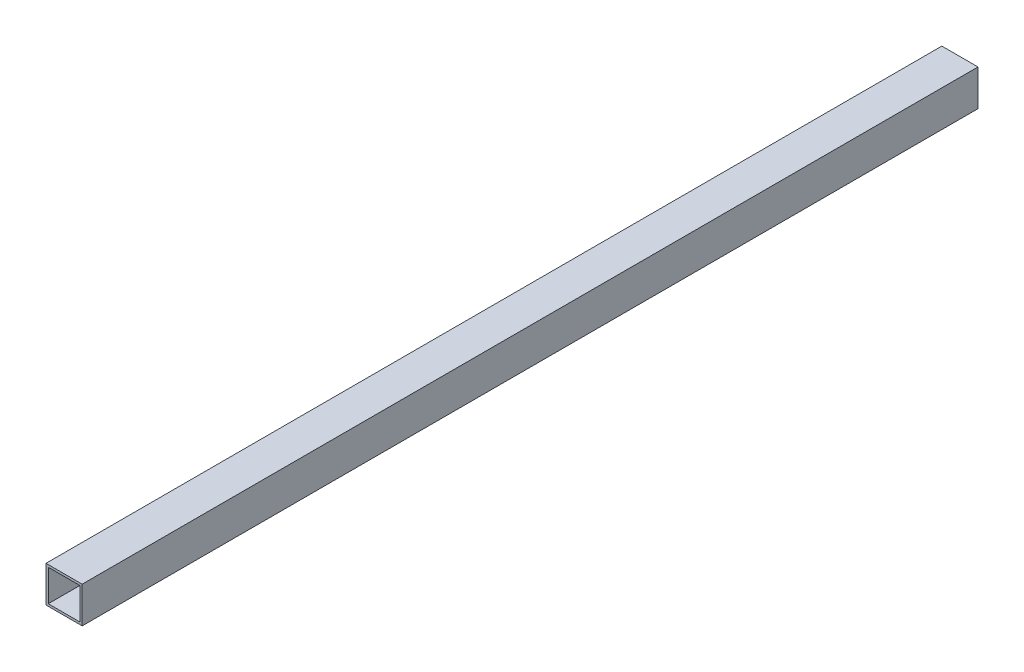
ISO-10303-21;
HEADER;
FILE_DESCRIPTION(('STEP AP214'),'2;1');
FILE_NAME('part.step','',(''),(''),'','','');
FILE_SCHEMA(('AUTOMOTIVE_DESIGN { 1 0 10303 214 1 1 1 1 }'));
ENDSEC;
DATA;
#1=APPLICATION_CONTEXT('core data for automotive mechanical design processes');
#2=APPLICATION_PROTOCOL_DEFINITION('international standard','automotive_design',2000,#1);
#3=PRODUCT_CONTEXT('',#1,'mechanical');
#4=PRODUCT('Part','Part','',(#3));
#5=PRODUCT_RELATED_PRODUCT_CATEGORY('part','',(#4));
#6=PRODUCT_DEFINITION_FORMATION('','',#4);
#7=PRODUCT_DEFINITION_CONTEXT('part definition',#1,'design');
#8=PRODUCT_DEFINITION('design','',#6,#7);
#9=PRODUCT_DEFINITION_SHAPE('','',#8);
#10=(LENGTH_UNIT() NAMED_UNIT(*) SI_UNIT(.MILLI.,.METRE.));
#11=(NAMED_UNIT(*) PLANE_ANGLE_UNIT() SI_UNIT($,.RADIAN.));
#12=(NAMED_UNIT(*) SI_UNIT($,.STERADIAN.) SOLID_ANGLE_UNIT());
#13=UNCERTAINTY_MEASURE_WITH_UNIT(LENGTH_MEASURE(1.E-05),#10,'distance_accuracy_value','');
#14=(GEOMETRIC_REPRESENTATION_CONTEXT(3) GLOBAL_UNCERTAINTY_ASSIGNED_CONTEXT((#13)) GLOBAL_UNIT_ASSIGNED_CONTEXT((#10,
#11,#12)) REPRESENTATION_CONTEXT('',''));
#15=CARTESIAN_POINT('',(0.,0.,0.));
#16=DIRECTION('',(0.,0.,1.));
#17=DIRECTION('',(1.,0.,0.));
#18=AXIS2_PLACEMENT_3D('',#15,#16,#17);
#19=CARTESIAN_POINT('',(0.,0.,314.6396933));
#20=DIRECTION('',(0.,0.,-1.));
#21=DIRECTION('',(-1.,0.,0.));
#22=AXIS2_PLACEMENT_3D('',#19,#20,#21);
#23=PLANE('',#22);
#24=DIRECTION('',(0.,-1.,0.));
#25=VECTOR('',#24,1.);
#26=CARTESIAN_POINT('',(-12.7,12.7,314.6396933));
#27=LINE('',#26,#25);
#28=CARTESIAN_POINT('',(-12.7,12.7,314.6396933));
#29=VERTEX_POINT('',#28);
#30=CARTESIAN_POINT('',(-12.7,-12.7,314.6396933));
#31=VERTEX_POINT('',#30);
#32=EDGE_CURVE('E134',#29,#31,#27,.T.);
#33=ORIENTED_EDGE('',*,*,#32,.T.);
#34=DIRECTION('',(1.,0.,0.));
#35=VECTOR('',#34,1.);
#36=CARTESIAN_POINT('',(12.7,-12.7,314.6396933));
#37=LINE('',#36,#35);
#38=CARTESIAN_POINT('',(12.7,-12.7,314.6396933));
#39=VERTEX_POINT('',#38);
#40=EDGE_CURVE('E137',#31,#39,#37,.T.);
#41=ORIENTED_EDGE('',*,*,#40,.T.);
#42=DIRECTION('',(0.,1.,0.));
#43=VECTOR('',#42,1.);
#44=CARTESIAN_POINT('',(12.7,12.7,314.6396933));
#45=LINE('',#44,#43);
#46=CARTESIAN_POINT('',(12.7,12.7,314.6396933));
#47=VERTEX_POINT('',#46);
#48=EDGE_CURVE('E140',#39,#47,#45,.T.);
#49=ORIENTED_EDGE('',*,*,#48,.T.);
#50=DIRECTION('',(-1.,0.,0.));
#51=VECTOR('',#50,1.);
#52=CARTESIAN_POINT('',(12.7,12.7,314.6396933));
#53=LINE('',#52,#51);
#54=EDGE_CURVE('E142',#47,#29,#53,.T.);
#55=ORIENTED_EDGE('',*,*,#54,.T.);
#56=EDGE_LOOP('',(#33,#41,#49,#55));
#57=FACE_BOUND('',#56,.T.);
#58=DIRECTION('',(0.,-1.,0.));
#59=VECTOR('',#58,1.);
#60=CARTESIAN_POINT('',(-11.1125,11.1125,314.6396933));
#61=LINE('',#60,#59);
#62=CARTESIAN_POINT('',(-11.1125,11.1125,314.6396933));
#63=VERTEX_POINT('',#62);
#64=CARTESIAN_POINT('',(-11.1125,-11.1125,314.6396933));
#65=VERTEX_POINT('',#64);
#66=EDGE_CURVE('E98',#63,#65,#61,.T.);
#67=ORIENTED_EDGE('',*,*,#66,.F.);
#68=DIRECTION('',(-1.,0.,0.));
#69=VECTOR('',#68,1.);
#70=CARTESIAN_POINT('',(11.1125,11.1125,314.6396933));
#71=LINE('',#70,#69);
#72=CARTESIAN_POINT('',(11.1125,11.1125,314.6396933));
#73=VERTEX_POINT('',#72);
#74=EDGE_CURVE('E120',#73,#63,#71,.T.);
#75=ORIENTED_EDGE('',*,*,#74,.F.);
#76=DIRECTION('',(0.,1.,0.));
#77=VECTOR('',#76,1.);
#78=CARTESIAN_POINT('',(11.1125,11.1125,314.6396933));
#79=LINE('',#78,#77);
#80=CARTESIAN_POINT('',(11.1125,-11.1125,314.6396933));
#81=VERTEX_POINT('',#80);
#82=EDGE_CURVE('E118',#81,#73,#79,.T.);
#83=ORIENTED_EDGE('',*,*,#82,.F.);
#84=DIRECTION('',(1.,0.,0.));
#85=VECTOR('',#84,1.);
#86=CARTESIAN_POINT('',(11.1125,-11.1125,314.6396933));
#87=LINE('',#86,#85);
#88=EDGE_CURVE('E106',#65,#81,#87,.T.);
#89=ORIENTED_EDGE('',*,*,#88,.F.);
#90=EDGE_LOOP('',(#67,#75,#83,#89));
#91=FACE_BOUND('',#90,.T.);
#92=ADVANCED_FACE('F33',(#57,#91),#23,.F.);
#93=CARTESIAN_POINT('',(0.,0.,-314.6396933));
#94=DIRECTION('',(0.,0.,-1.));
#95=DIRECTION('',(-1.,0.,0.));
#96=AXIS2_PLACEMENT_3D('',#93,#94,#95);
#97=PLANE('',#96);
#98=DIRECTION('',(0.,-1.,0.));
#99=VECTOR('',#98,1.);
#100=CARTESIAN_POINT('',(-12.7,12.7,-314.6396933));
#101=LINE('',#100,#99);
#102=CARTESIAN_POINT('',(-12.7,12.7,-314.6396933));
#103=VERTEX_POINT('',#102);
#104=CARTESIAN_POINT('',(-12.7,-12.7,-314.6396933));
#105=VERTEX_POINT('',#104);
#106=EDGE_CURVE('E114',#103,#105,#101,.T.);
#107=ORIENTED_EDGE('',*,*,#106,.F.);
#108=DIRECTION('',(-1.,0.,0.));
#109=VECTOR('',#108,1.);
#110=CARTESIAN_POINT('',(12.7,12.7,-314.6396933));
#111=LINE('',#110,#109);
#112=CARTESIAN_POINT('',(12.7,12.7,-314.6396933));
#113=VERTEX_POINT('',#112);
#114=EDGE_CURVE('E138',#113,#103,#111,.T.);
#115=ORIENTED_EDGE('',*,*,#114,.F.);
#116=DIRECTION('',(0.,1.,0.));
#117=VECTOR('',#116,1.);
#118=CARTESIAN_POINT('',(12.7,12.7,-314.6396933));
#119=LINE('',#118,#117);
#120=CARTESIAN_POINT('',(12.7,-12.7,-314.6396933));
#121=VERTEX_POINT('',#120);
#122=EDGE_CURVE('E149',#121,#113,#119,.T.);
#123=ORIENTED_EDGE('',*,*,#122,.F.);
#124=DIRECTION('',(1.,0.,0.));
#125=VECTOR('',#124,1.);
#126=CARTESIAN_POINT('',(12.7,-12.7,-314.6396933));
#127=LINE('',#126,#125);
#128=EDGE_CURVE('E147',#105,#121,#127,.T.);
#129=ORIENTED_EDGE('',*,*,#128,.F.);
#130=EDGE_LOOP('',(#107,#115,#123,#129));
#131=FACE_BOUND('',#130,.T.);
#132=DIRECTION('',(-1.,0.,0.));
#133=VECTOR('',#132,1.);
#134=CARTESIAN_POINT('',(11.1125,11.1125,-314.6396933));
#135=LINE('',#134,#133);
#136=CARTESIAN_POINT('',(11.1125,11.1125,-314.6396933));
#137=VERTEX_POINT('',#136);
#138=CARTESIAN_POINT('',(-11.1125,11.1125,-314.6396933));
#139=VERTEX_POINT('',#138);
#140=EDGE_CURVE('E107',#137,#139,#135,.T.);
#141=ORIENTED_EDGE('',*,*,#140,.T.);
#142=DIRECTION('',(0.,-1.,0.));
#143=VECTOR('',#142,1.);
#144=CARTESIAN_POINT('',(-11.1125,11.1125,-314.6396933));
#145=LINE('',#144,#143);
#146=CARTESIAN_POINT('',(-11.1125,-11.1125,-314.6396933));
#147=VERTEX_POINT('',#146);
#148=EDGE_CURVE('E56',#139,#147,#145,.T.);
#149=ORIENTED_EDGE('',*,*,#148,.T.);
#150=DIRECTION('',(1.,0.,0.));
#151=VECTOR('',#150,1.);
#152=CARTESIAN_POINT('',(11.1125,-11.1125,-314.6396933));
#153=LINE('',#152,#151);
#154=CARTESIAN_POINT('',(11.1125,-11.1125,-314.6396933));
#155=VERTEX_POINT('',#154);
#156=EDGE_CURVE('E113',#147,#155,#153,.T.);
#157=ORIENTED_EDGE('',*,*,#156,.T.);
#158=DIRECTION('',(0.,1.,0.));
#159=VECTOR('',#158,1.);
#160=CARTESIAN_POINT('',(11.1125,11.1125,-314.6396933));
#161=LINE('',#160,#159);
#162=EDGE_CURVE('E126',#155,#137,#161,.T.);
#163=ORIENTED_EDGE('',*,*,#162,.T.);
#164=EDGE_LOOP('',(#141,#149,#157,#163));
#165=FACE_BOUND('',#164,.T.);
#166=ADVANCED_FACE('F167',(#131,#165),#97,.T.);
#167=CARTESIAN_POINT('',(-12.7,12.7,314.6396933));
#168=DIRECTION('',(1.,0.,0.));
#169=DIRECTION('',(0.,1.,0.));
#170=AXIS2_PLACEMENT_3D('',#167,#168,#169);
#171=PLANE('',#170);
#172=ORIENTED_EDGE('',*,*,#106,.T.);
#173=DIRECTION('',(0.,0.,-1.));
#174=VECTOR('',#173,1.);
#175=CARTESIAN_POINT('',(-12.7,-12.7,314.6396933));
#176=LINE('',#175,#174);
#177=EDGE_CURVE('E11',#31,#105,#176,.T.);
#178=ORIENTED_EDGE('',*,*,#177,.F.);
#179=ORIENTED_EDGE('',*,*,#32,.F.);
#180=DIRECTION('',(0.,0.,-1.));
#181=VECTOR('',#180,1.);
#182=CARTESIAN_POINT('',(-12.7,12.7,314.6396933));
#183=LINE('',#182,#181);
#184=EDGE_CURVE('E144',#29,#103,#183,.T.);
#185=ORIENTED_EDGE('',*,*,#184,.T.);
#186=EDGE_LOOP('',(#172,#178,#179,#185));
#187=FACE_BOUND('',#186,.T.);
#188=ADVANCED_FACE('F35',(#187),#171,.F.);
#189=CARTESIAN_POINT('',(12.7,-12.7,314.6396933));
#190=DIRECTION('',(0.,1.,0.));
#191=DIRECTION('',(-1.,0.,0.));
#192=AXIS2_PLACEMENT_3D('',#189,#190,#191);
#193=PLANE('',#192);
#194=ORIENTED_EDGE('',*,*,#128,.T.);
#195=DIRECTION('',(0.,0.,-1.));
#196=VECTOR('',#195,1.);
#197=CARTESIAN_POINT('',(12.7,-12.7,314.6396933));
#198=LINE('',#197,#196);
#199=EDGE_CURVE('E41',#39,#121,#198,.T.);
#200=ORIENTED_EDGE('',*,*,#199,.F.);
#201=ORIENTED_EDGE('',*,*,#40,.F.);
#202=ORIENTED_EDGE('',*,*,#177,.T.);
#203=EDGE_LOOP('',(#194,#200,#201,#202));
#204=FACE_BOUND('',#203,.T.);
#205=ADVANCED_FACE('F177',(#204),#193,.F.);
#206=CARTESIAN_POINT('',(12.7,12.7,314.6396933));
#207=DIRECTION('',(-1.,0.,0.));
#208=DIRECTION('',(0.,-1.,0.));
#209=AXIS2_PLACEMENT_3D('',#206,#207,#208);
#210=PLANE('',#209);
#211=ORIENTED_EDGE('',*,*,#122,.T.);
#212=DIRECTION('',(0.,0.,-1.));
#213=VECTOR('',#212,1.);
#214=CARTESIAN_POINT('',(12.7,12.7,314.6396933));
#215=LINE('',#214,#213);
#216=EDGE_CURVE('E154',#47,#113,#215,.T.);
#217=ORIENTED_EDGE('',*,*,#216,.F.);
#218=ORIENTED_EDGE('',*,*,#48,.F.);
#219=ORIENTED_EDGE('',*,*,#199,.T.);
#220=EDGE_LOOP('',(#211,#217,#218,#219));
#221=FACE_BOUND('',#220,.T.);
#222=ADVANCED_FACE('F161',(#221),#210,.F.);
#223=CARTESIAN_POINT('',(12.7,12.7,314.6396933));
#224=DIRECTION('',(0.,-1.,0.));
#225=DIRECTION('',(0.,0.,-1.));
#226=AXIS2_PLACEMENT_3D('',#223,#224,#225);
#227=PLANE('',#226);
#228=ORIENTED_EDGE('',*,*,#114,.T.);
#229=ORIENTED_EDGE('',*,*,#184,.F.);
#230=ORIENTED_EDGE('',*,*,#54,.F.);
#231=ORIENTED_EDGE('',*,*,#216,.T.);
#232=EDGE_LOOP('',(#228,#229,#230,#231));
#233=FACE_BOUND('',#232,.T.);
#234=ADVANCED_FACE('F171',(#233),#227,.F.);
#235=CARTESIAN_POINT('',(-11.1125,11.1125,314.6396933));
#236=DIRECTION('',(1.,0.,0.));
#237=DIRECTION('',(0.,0.,-1.));
#238=AXIS2_PLACEMENT_3D('',#235,#236,#237);
#239=PLANE('',#238);
#240=ORIENTED_EDGE('',*,*,#148,.F.);
#241=DIRECTION('',(0.,0.,-1.));
#242=VECTOR('',#241,1.);
#243=CARTESIAN_POINT('',(-11.1125,11.1125,314.6396933));
#244=LINE('',#243,#242);
#245=EDGE_CURVE('E102',#63,#139,#244,.T.);
#246=ORIENTED_EDGE('',*,*,#245,.F.);
#247=ORIENTED_EDGE('',*,*,#66,.T.);
#248=DIRECTION('',(0.,0.,-1.));
#249=VECTOR('',#248,1.);
#250=CARTESIAN_POINT('',(-11.1125,-11.1125,314.6396933));
#251=LINE('',#250,#249);
#252=EDGE_CURVE('E101',#65,#147,#251,.T.);
#253=ORIENTED_EDGE('',*,*,#252,.T.);
#254=EDGE_LOOP('',(#240,#246,#247,#253));
#255=FACE_BOUND('',#254,.T.);
#256=ADVANCED_FACE('F100',(#255),#239,.T.);
#257=CARTESIAN_POINT('',(11.1125,-11.1125,314.6396933));
#258=DIRECTION('',(0.,1.,0.));
#259=DIRECTION('',(0.,0.,1.));
#260=AXIS2_PLACEMENT_3D('',#257,#258,#259);
#261=PLANE('',#260);
#262=ORIENTED_EDGE('',*,*,#156,.F.);
#263=ORIENTED_EDGE('',*,*,#252,.F.);
#264=ORIENTED_EDGE('',*,*,#88,.T.);
#265=DIRECTION('',(0.,0.,-1.));
#266=VECTOR('',#265,1.);
#267=CARTESIAN_POINT('',(11.1125,-11.1125,314.6396933));
#268=LINE('',#267,#266);
#269=EDGE_CURVE('E115',#81,#155,#268,.T.);
#270=ORIENTED_EDGE('',*,*,#269,.T.);
#271=EDGE_LOOP('',(#262,#263,#264,#270));
#272=FACE_BOUND('',#271,.T.);
#273=ADVANCED_FACE('F110',(#272),#261,.T.);
#274=CARTESIAN_POINT('',(11.1125,11.1125,314.6396933));
#275=DIRECTION('',(-1.,0.,0.));
#276=DIRECTION('',(0.,0.,1.));
#277=AXIS2_PLACEMENT_3D('',#274,#275,#276);
#278=PLANE('',#277);
#279=ORIENTED_EDGE('',*,*,#162,.F.);
#280=ORIENTED_EDGE('',*,*,#269,.F.);
#281=ORIENTED_EDGE('',*,*,#82,.T.);
#282=DIRECTION('',(0.,0.,-1.));
#283=VECTOR('',#282,1.);
#284=CARTESIAN_POINT('',(11.1125,11.1125,314.6396933));
#285=LINE('',#284,#283);
#286=EDGE_CURVE('E48',#73,#137,#285,.T.);
#287=ORIENTED_EDGE('',*,*,#286,.T.);
#288=EDGE_LOOP('',(#279,#280,#281,#287));
#289=FACE_BOUND('',#288,.T.);
#290=ADVANCED_FACE('F200',(#289),#278,.T.);
#291=CARTESIAN_POINT('',(11.1125,11.1125,314.6396933));
#292=DIRECTION('',(0.,-1.,0.));
#293=DIRECTION('',(0.,0.,-1.));
#294=AXIS2_PLACEMENT_3D('',#291,#292,#293);
#295=PLANE('',#294);
#296=ORIENTED_EDGE('',*,*,#140,.F.);
#297=ORIENTED_EDGE('',*,*,#286,.F.);
#298=ORIENTED_EDGE('',*,*,#74,.T.);
#299=ORIENTED_EDGE('',*,*,#245,.T.);
#300=EDGE_LOOP('',(#296,#297,#298,#299));
#301=FACE_BOUND('',#300,.T.);
#302=ADVANCED_FACE('F204',(#301),#295,.T.);
#303=CLOSED_SHELL('',(#92,#166,#188,#205,#222,#234,#256,#273,#290,#302));
#304=MANIFOLD_SOLID_BREP('B2',#303);
#305=ADVANCED_BREP_SHAPE_REPRESENTATION('',(#18,#304),#14);
#306=SHAPE_DEFINITION_REPRESENTATION(#9,#305);
ENDSEC;
END-ISO-10303-21;
